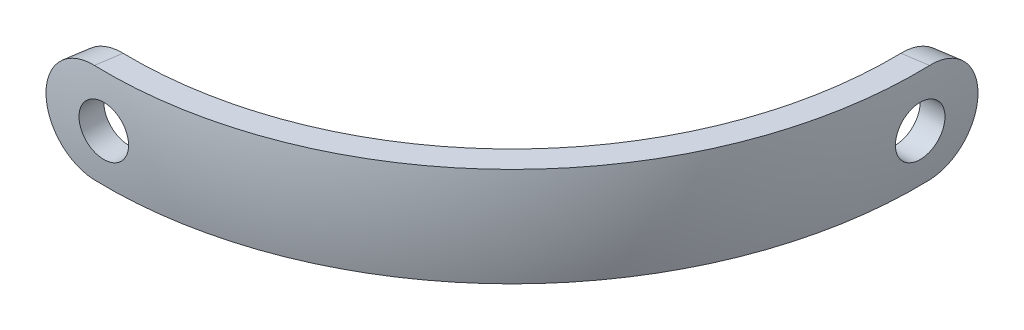
ISO-10303-21;
HEADER;
FILE_DESCRIPTION(('STEP AP214'),'2;1');
FILE_NAME('part.step','',(''),(''),'','','');
FILE_SCHEMA(('AUTOMOTIVE_DESIGN { 1 0 10303 214 1 1 1 1 }'));
ENDSEC;
DATA;
#1=APPLICATION_CONTEXT('core data for automotive mechanical design processes');
#2=APPLICATION_PROTOCOL_DEFINITION('international standard','automotive_design',2000,#1);
#3=PRODUCT_CONTEXT('',#1,'mechanical');
#4=PRODUCT('Part','Part','',(#3));
#5=PRODUCT_RELATED_PRODUCT_CATEGORY('part','',(#4));
#6=PRODUCT_DEFINITION_FORMATION('','',#4);
#7=PRODUCT_DEFINITION_CONTEXT('part definition',#1,'design');
#8=PRODUCT_DEFINITION('design','',#6,#7);
#9=PRODUCT_DEFINITION_SHAPE('','',#8);
#10=(LENGTH_UNIT() NAMED_UNIT(*) SI_UNIT(.MILLI.,.METRE.));
#11=(NAMED_UNIT(*) PLANE_ANGLE_UNIT() SI_UNIT($,.RADIAN.));
#12=(NAMED_UNIT(*) SI_UNIT($,.STERADIAN.) SOLID_ANGLE_UNIT());
#13=UNCERTAINTY_MEASURE_WITH_UNIT(LENGTH_MEASURE(1.E-05),#10,'distance_accuracy_value','');
#14=(GEOMETRIC_REPRESENTATION_CONTEXT(3) GLOBAL_UNCERTAINTY_ASSIGNED_CONTEXT((#13)) GLOBAL_UNIT_ASSIGNED_CONTEXT((#10,
#11,#12)) REPRESENTATION_CONTEXT('',''));
#15=CARTESIAN_POINT('',(0.,0.,0.));
#16=DIRECTION('',(0.,0.,1.));
#17=DIRECTION('',(1.,0.,0.));
#18=AXIS2_PLACEMENT_3D('',#15,#16,#17);
#19=CARTESIAN_POINT('',(0.,0.,0.));
#20=DIRECTION('',(0.,1.,0.));
#21=DIRECTION('',(-0.15093609829513,0.,0.988543521667834));
#22=AXIS2_PLACEMENT_3D('',#19,#20,#21);
#23=SPHERICAL_SURFACE('',#22,66.);
#24=CARTESIAN_POINT('',(0.,-8.,0.));
#25=DIRECTION('',(0.,1.,0.));
#26=DIRECTION('',(0.,0.,1.));
#27=AXIS2_PLACEMENT_3D('',#24,#25,#26);
#28=CIRCLE('',#27,65.5133574166368);
#29=CARTESIAN_POINT('',(-1.90598073848106,-8.,65.4856261894512));
#30=VERTEX_POINT('',#29);
#31=CARTESIAN_POINT('',(65.4856261894512,-8.,-1.90598073848083));
#32=VERTEX_POINT('',#31);
#33=EDGE_CURVE('E108',#30,#32,#28,.T.);
#34=ORIENTED_EDGE('',*,*,#33,.T.);
#35=CARTESIAN_POINT('',(65.4856261894513,-8.00000000000002,-1.90598073848083));
#36=CARTESIAN_POINT('',(65.4789954262735,-8.0000233103956,-2.13380636503772));
#37=CARTESIAN_POINT('',(65.4723466680324,-7.99040586848372,-2.36162869269555));
#38=CARTESIAN_POINT('',(65.4590615649028,-7.95205630562123,-2.81565226137605));
#39=CARTESIAN_POINT('',(65.4524252196232,-7.92332479719068,-3.04185355411083));
#40=CARTESIAN_POINT('',(65.4392164665826,-7.8469344483001,-3.49091461906332));
#41=CARTESIAN_POINT('',(65.4326440263639,-7.79928579247757,-3.7137761224706));
#42=CARTESIAN_POINT('',(65.4196082515972,-7.68539154829749,-4.15469523181643));
#43=CARTESIAN_POINT('',(65.4131449153759,-7.61914624544452,-4.37275291145015));
#44=CARTESIAN_POINT('',(65.4003723194107,-7.46846441023646,-4.80263336844799));
#45=CARTESIAN_POINT('',(65.3940631484835,-7.38401765464266,-5.01445256552379));
#46=CARTESIAN_POINT('',(65.3816509779747,-7.19753197333296,-5.43021139144909));
#47=CARTESIAN_POINT('',(65.3755479819381,-7.09549274531808,-5.63415088482455));
#48=CARTESIAN_POINT('',(65.3635973701703,-6.87455245634858,-6.03262714797209));
#49=CARTESIAN_POINT('',(65.3577496940183,-6.75565541335527,-6.22716614352601));
#50=CARTESIAN_POINT('',(65.3463546734433,-6.50180679345798,-6.60547962172241));
#51=CARTESIAN_POINT('',(65.3408073264033,-6.36685535647739,-6.78925419816224));
#52=CARTESIAN_POINT('',(65.330076416556,-6.08233584219565,-7.14407924927709));
#53=CARTESIAN_POINT('',(65.3248916570049,-5.93282016731225,-7.31517170627174));
#54=CARTESIAN_POINT('',(65.3149071359619,-5.61982791940914,-7.64408273801211));
#55=CARTESIAN_POINT('',(65.3101073719165,-5.45635143899958,-7.80190140079685));
#56=CARTESIAN_POINT('',(65.3009316167273,-5.11655454974038,-8.10313406933744));
#57=CARTESIAN_POINT('',(65.2965557115089,-4.94023154926556,-8.24654515458513));
#58=CARTESIAN_POINT('',(65.2882656149023,-4.57602698024453,-8.51785947995783));
#59=CARTESIAN_POINT('',(65.2843514135424,-4.38814566146545,-8.64576305501192));
#60=CARTESIAN_POINT('',(65.2770429270389,-4.00348106201142,-8.88429430877204));
#61=CARTESIAN_POINT('',(65.2736452821293,-3.80676713315995,-8.9950337267011));
#62=CARTESIAN_POINT('',(65.2673671119725,-3.4046652121777,-9.19945243433636));
#63=CARTESIAN_POINT('',(65.2644865740594,-3.19927743265474,-9.29313214190055));
#64=CARTESIAN_POINT('',(65.2592686408014,-2.78139642315218,-9.46269001732263));
#65=CARTESIAN_POINT('',(65.2569309497075,-2.56890713468049,-9.53857787859032));
#66=CARTESIAN_POINT('',(65.2528175009855,-2.13833429253245,-9.67202954219864));
#67=CARTESIAN_POINT('',(65.2510415972016,-1.92025220987702,-9.7295981105481));
#68=CARTESIAN_POINT('',(65.2476678217308,-1.42093834111765,-9.83891970300549));
#69=CARTESIAN_POINT('',(65.2462448406436,-1.13842816357406,-9.88499151160208));
#70=CARTESIAN_POINT('',(65.2448216968505,-0.712518044561883,-9.9310605436528));
#71=CARTESIAN_POINT('',(65.2444658706974,-0.570265376442735,-9.94257709645125));
#72=CARTESIAN_POINT('',(65.2439912519057,-0.285352698509678,-9.95793735613073));
#73=CARTESIAN_POINT('',(65.2438724480644,-0.142692708266861,-9.9617814256485));
#74=CARTESIAN_POINT('',(65.2438724300771,0.,-9.96178248747833));
#75=B_SPLINE_CURVE_WITH_KNOTS('',3,(#35,#36,#37,#38,#39,#40,#41,#42,#43,#44,#45,#46,#47,#48,#49,
#50,#51,#52,#53,#54,#55,#56,#57,#58,#59,#60,#61,#62,#63,#64,#65,#66,#67,#68,#69,#70,#71,#72,#73,
#74),.UNSPECIFIED.,.F.,.F.,(4,2,2,2,2,2,2,2,2,2,2,2,2,2,2,2,2,2,2,4),(0.,0.68355968715997,
1.36709747035441,2.05026774758158,2.7334275370268,3.41697204250441,4.10052829479083,
4.78392189847771,5.46730954642771,6.14832330234018,6.82933254104259,7.51047954731539,
8.19161183964679,8.86810465473374,9.54458089767794,10.2206877197506,10.8966184995181,
11.7534745712575,12.1814558336121,12.6094168671308),.UNSPECIFIED.);
#76=CARTESIAN_POINT('',(65.2438724300771,0.,-9.96178248747833));
#77=VERTEX_POINT('',#76);
#78=EDGE_CURVE('E164',#32,#77,#75,.T.);
#79=ORIENTED_EDGE('',*,*,#78,.T.);
#80=CARTESIAN_POINT('',(65.2438724300771,0.,-9.96178248747833));
#81=CARTESIAN_POINT('',(65.2438715281821,0.223815813935489,-9.96180767475398));
#82=CARTESIAN_POINT('',(65.2441646200338,0.44762756064614,-9.95232678670516));
#83=CARTESIAN_POINT('',(65.2453322640976,0.893640690685671,-9.91453513295925));
#84=CARTESIAN_POINT('',(65.2462067800849,1.11584217346776,-9.88622554035564));
#85=CARTESIAN_POINT('',(65.2485296336511,1.55684949221986,-9.81099476004609));
#86=CARTESIAN_POINT('',(65.2499774207248,1.77565837719574,-9.76409142763105));
#87=CARTESIAN_POINT('',(65.253434103878,2.20854276854098,-9.65202872262628));
#88=CARTESIAN_POINT('',(65.2554429946425,2.42261831972601,-9.58686952296478));
#89=CARTESIAN_POINT('',(65.2600057421423,2.84460767363624,-9.43874403823712));
#90=CARTESIAN_POINT('',(65.2625598174613,3.05251896670285,-9.35577061074614));
#91=CARTESIAN_POINT('',(65.2681908379462,3.4606281390898,-9.17264130519558));
#92=CARTESIAN_POINT('',(65.2712677934979,3.6608258651041,-9.07248508584597));
#93=CARTESIAN_POINT('',(65.2779182536187,4.0520736893096,-8.85573855454025));
#94=CARTESIAN_POINT('',(65.2814916921116,4.24312500024299,-8.73915042945478));
#95=CARTESIAN_POINT('',(65.2891057170139,4.61477685309646,-8.49037849568757));
#96=CARTESIAN_POINT('',(65.2931463022765,4.79537742067364,-8.35819472529634));
#97=CARTESIAN_POINT('',(65.3016742417094,5.14540354353712,-8.07876732231392));
#98=CARTESIAN_POINT('',(65.3061628996878,5.31479395225281,-7.93147970429566));
#99=CARTESIAN_POINT('',(65.3155417434446,5.64068705350649,-7.6231887931853));
#100=CARTESIAN_POINT('',(65.320432059081,5.79718554500619,-7.46218106367407));
#101=CARTESIAN_POINT('',(65.3305738296018,6.09616512663733,-7.12763970755624));
#102=CARTESIAN_POINT('',(65.3358252971299,6.23864572558021,-6.95410564239451));
#103=CARTESIAN_POINT('',(65.3466476715699,6.50861389975807,-6.59575158349769));
#104=CARTESIAN_POINT('',(65.3522185812293,6.63610134600025,-6.41093149268463));
#105=CARTESIAN_POINT('',(65.3636777943065,6.8760862765547,-6.02993756857892));
#106=CARTESIAN_POINT('',(65.3695681026782,6.98846861944511,-5.83369125732056));
#107=CARTESIAN_POINT('',(65.3815808986342,7.19634670784248,-5.43254364953888));
#108=CARTESIAN_POINT('',(65.387703308335,7.29184805805133,-5.2276452537135));
#109=CARTESIAN_POINT('',(65.4001344745942,7.46534787542045,-4.81061436910646));
#110=CARTESIAN_POINT('',(65.4064431919309,7.54334999723002,-4.5984834015015));
#111=CARTESIAN_POINT('',(65.4191982107735,7.68133407609446,-4.16853128012712));
#112=CARTESIAN_POINT('',(65.4256444815396,7.74132001506257,-3.95071139530001));
#113=CARTESIAN_POINT('',(65.4409672059143,7.86116336458124,-3.43163143664057));
#114=CARTESIAN_POINT('',(65.4498844438318,7.91322690154687,-3.12851737334894));
#115=CARTESIAN_POINT('',(65.463287886478,7.96528555998269,-2.67128048811481));
#116=CARTESIAN_POINT('',(65.4677581104079,7.9782989949768,-2.5185157259701));
#117=CARTESIAN_POINT('',(65.4766965844778,7.99565488126796,-2.21250765463606));
#118=CARTESIAN_POINT('',(65.4811648347559,7.99999808827434,-2.05926438832007));
#119=CARTESIAN_POINT('',(65.4856261894512,8.,-1.90598073848083));
#120=B_SPLINE_CURVE_WITH_KNOTS('',3,(#80,#81,#82,#83,#84,#85,#86,#87,#88,#89,#90,#91,#92,#93,
#94,#95,#96,#97,#98,#99,#100,#101,#102,#103,#104,#105,#106,#107,#108,#109,#110,#111,#112,#113,
#114,#115,#116,#117,#118,#119),.UNSPECIFIED.,.F.,.F.,(4,2,2,2,2,2,2,2,2,2,2,2,2,2,2,2,2,2,2,4),
(0.,0.671240685404947,1.34243955410822,2.01299543582438,2.68354496593199,3.35436384947467,
4.02519605857631,4.69593907288629,5.36668044041832,6.03943382022609,6.71240556738392,
7.38540088715677,8.0584019965863,8.7362728962071,9.41391830969144,10.0914220674098,
10.7687759737513,11.6895613996959,12.1495054817856,12.6094094727469),.UNSPECIFIED.);
#121=CARTESIAN_POINT('',(65.4856261894512,8.,-1.90598073848083));
#122=VERTEX_POINT('',#121);
#123=EDGE_CURVE('E158',#77,#122,#120,.T.);
#124=ORIENTED_EDGE('',*,*,#123,.T.);
#125=CARTESIAN_POINT('',(0.,8.,0.));
#126=DIRECTION('',(0.,1.,0.));
#127=DIRECTION('',(0.,0.,1.));
#128=AXIS2_PLACEMENT_3D('',#125,#126,#127);
#129=CIRCLE('',#128,65.5133574166368);
#130=CARTESIAN_POINT('',(-1.90598073848106,8.,65.4856261894512));
#131=VERTEX_POINT('',#130);
#132=EDGE_CURVE('E110',#131,#122,#129,.T.);
#133=ORIENTED_EDGE('',*,*,#132,.F.);
#134=CARTESIAN_POINT('',(-1.90598073848106,8.,65.4856261894513));
#135=CARTESIAN_POINT('',(-2.13380636503794,8.00002331039559,65.4789954262735));
#136=CARTESIAN_POINT('',(-2.36162869269578,7.99040586848371,65.4723466680324));
#137=CARTESIAN_POINT('',(-2.81565226137628,7.95205630562121,65.4590615649028));
#138=CARTESIAN_POINT('',(-3.04185355411106,7.92332479719066,65.4524252196232));
#139=CARTESIAN_POINT('',(-3.49091461906355,7.84693444830008,65.4392164665826));
#140=CARTESIAN_POINT('',(-3.71377612247082,7.79928579247756,65.4326440263639));
#141=CARTESIAN_POINT('',(-4.15469523181665,7.68539154829748,65.4196082515972));
#142=CARTESIAN_POINT('',(-4.37275291145037,7.6191462454445,65.4131449153759));
#143=CARTESIAN_POINT('',(-4.80263336844821,7.46846441023645,65.4003723194107));
#144=CARTESIAN_POINT('',(-5.01445256552401,7.38401765464265,65.3940631484835));
#145=CARTESIAN_POINT('',(-5.43021139144931,7.19753197333295,65.3816509779747));
#146=CARTESIAN_POINT('',(-5.63415088482477,7.09549274531806,65.3755479819381));
#147=CARTESIAN_POINT('',(-6.03262714797231,6.87455245634856,65.3635973701703));
#148=CARTESIAN_POINT('',(-6.22716614352623,6.75565541335526,65.3577496940183));
#149=CARTESIAN_POINT('',(-6.60547962172263,6.50180679345797,65.3463546734433));
#150=CARTESIAN_POINT('',(-6.78925419816246,6.36685535647738,65.3408073264033));
#151=CARTESIAN_POINT('',(-7.14407924927731,6.08233584219563,65.330076416556));
#152=CARTESIAN_POINT('',(-7.31517170627196,5.93282016731223,65.3248916570049));
#153=CARTESIAN_POINT('',(-7.64408273801233,5.61982791940912,65.3149071359619));
#154=CARTESIAN_POINT('',(-7.80190140079706,5.45635143899957,65.3101073719165));
#155=CARTESIAN_POINT('',(-8.10313406933766,5.11655454974037,65.3009316167273));
#156=CARTESIAN_POINT('',(-8.24654515458535,4.94023154926555,65.2965557115089));
#157=CARTESIAN_POINT('',(-8.51785947995805,4.57602698024452,65.2882656149023));
#158=CARTESIAN_POINT('',(-8.64576305501214,4.38814566146545,65.2843514135424));
#159=CARTESIAN_POINT('',(-8.88429430877226,4.00348106201141,65.2770429270388));
#160=CARTESIAN_POINT('',(-8.99503372670132,3.80676713315995,65.2736452821293));
#161=CARTESIAN_POINT('',(-9.19945243433658,3.40466521217769,65.2673671119725));
#162=CARTESIAN_POINT('',(-9.29313214190077,3.19927743265473,65.2644865740594));
#163=CARTESIAN_POINT('',(-9.46269001732285,2.78139642315217,65.2592686408013));
#164=CARTESIAN_POINT('',(-9.53857787859054,2.56890713468048,65.2569309497075));
#165=CARTESIAN_POINT('',(-9.67202954219886,2.13833429253245,65.2528175009855));
#166=CARTESIAN_POINT('',(-9.72959811054832,1.92025220987701,65.2510415972015));
#167=CARTESIAN_POINT('',(-9.8389197030057,1.42093834111764,65.2476678217307));
#168=CARTESIAN_POINT('',(-9.8849915116023,1.13842816357404,65.2462448406435));
#169=CARTESIAN_POINT('',(-9.93106054365302,0.712518044561869,65.2448216968504));
#170=CARTESIAN_POINT('',(-9.94257709645147,0.570265376442721,65.2444658706974));
#171=CARTESIAN_POINT('',(-9.95793735613095,0.285352698509663,65.2439912519057));
#172=CARTESIAN_POINT('',(-9.96178142564872,0.142692708266845,65.2438724480644));
#173=CARTESIAN_POINT('',(-9.96178248747855,0.,65.243872430077));
#174=B_SPLINE_CURVE_WITH_KNOTS('',3,(#134,#135,#136,#137,#138,#139,#140,#141,#142,#143,#144,
#145,#146,#147,#148,#149,#150,#151,#152,#153,#154,#155,#156,#157,#158,#159,#160,#161,#162,#163,
#164,#165,#166,#167,#168,#169,#170,#171,#172,#173),.UNSPECIFIED.,.F.,.F.,(4,2,2,2,2,2,2,2,2,2,2,
2,2,2,2,2,2,2,2,4),(0.,0.68355968715997,1.36709747035441,2.05026774758158,2.7334275370268,
3.4169720425044,4.10052829479082,4.7839218984777,5.4673095464277,6.14832330234017,
6.82933254104258,7.51047954731538,8.19161183964677,8.86810465473373,9.54458089767793,
10.2206877197505,10.8966184995181,11.7534745712575,12.1814558336121,12.6094168671308),.UNSPECIFIED.);
#175=CARTESIAN_POINT('',(-9.96178248747855,0.,65.243872430077));
#176=VERTEX_POINT('',#175);
#177=EDGE_CURVE('E133',#131,#176,#174,.T.);
#178=ORIENTED_EDGE('',*,*,#177,.T.);
#179=CARTESIAN_POINT('',(-9.96178248747855,0.,65.243872430077));
#180=CARTESIAN_POINT('',(-9.9618076747542,-0.223815813935505,65.2438715281821));
#181=CARTESIAN_POINT('',(-9.95232678670538,-0.447627560646156,65.2441646200338));
#182=CARTESIAN_POINT('',(-9.91453513295947,-0.893640690685688,65.2453322640976));
#183=CARTESIAN_POINT('',(-9.88622554035586,-1.11584217346777,65.2462067800849));
#184=CARTESIAN_POINT('',(-9.81099476004631,-1.55684949221988,65.2485296336511));
#185=CARTESIAN_POINT('',(-9.76409142763128,-1.77565837719576,65.2499774207248));
#186=CARTESIAN_POINT('',(-9.65202872262651,-2.208542768541,65.253434103878));
#187=CARTESIAN_POINT('',(-9.586869522965,-2.42261831972603,65.2554429946425));
#188=CARTESIAN_POINT('',(-9.43874403823734,-2.84460767363626,65.2600057421423));
#189=CARTESIAN_POINT('',(-9.35577061074636,-3.05251896670287,65.2625598174612));
#190=CARTESIAN_POINT('',(-9.1726413051958,-3.46062813908982,65.2681908379462));
#191=CARTESIAN_POINT('',(-9.07248508584618,-3.66082586510412,65.2712677934979));
#192=CARTESIAN_POINT('',(-8.85573855454046,-4.05207368930962,65.2779182536187));
#193=CARTESIAN_POINT('',(-8.73915042945499,-4.24312500024301,65.2814916921115));
#194=CARTESIAN_POINT('',(-8.49037849568779,-4.61477685309647,65.2891057170139));
#195=CARTESIAN_POINT('',(-8.35819472529656,-4.79537742067366,65.2931463022764));
#196=CARTESIAN_POINT('',(-8.07876732231414,-5.14540354353714,65.3016742417094));
#197=CARTESIAN_POINT('',(-7.93147970429587,-5.31479395225283,65.3061628996877));
#198=CARTESIAN_POINT('',(-7.62318879318552,-5.6406870535065,65.3155417434446));
#199=CARTESIAN_POINT('',(-7.46218106367429,-5.7971855450062,65.320432059081));
#200=CARTESIAN_POINT('',(-7.12763970755646,-6.09616512663734,65.3305738296017));
#201=CARTESIAN_POINT('',(-6.95410564239474,-6.23864572558023,65.3358252971299));
#202=CARTESIAN_POINT('',(-6.59575158349791,-6.50861389975809,65.3466476715699));
#203=CARTESIAN_POINT('',(-6.41093149268486,-6.63610134600027,65.3522185812293));
#204=CARTESIAN_POINT('',(-6.02993756857914,-6.87608627655472,65.3636777943065));
#205=CARTESIAN_POINT('',(-5.83369125732079,-6.98846861944513,65.3695681026782));
#206=CARTESIAN_POINT('',(-5.4325436495391,-7.19634670784249,65.3815808986342));
#207=CARTESIAN_POINT('',(-5.22764525371372,-7.29184805805135,65.387703308335));
#208=CARTESIAN_POINT('',(-4.81061436910669,-7.46534787542047,65.4001344745942));
#209=CARTESIAN_POINT('',(-4.59848340150172,-7.54334999723003,65.4064431919309));
#210=CARTESIAN_POINT('',(-4.16853128012735,-7.68133407609448,65.4191982107734));
#211=CARTESIAN_POINT('',(-3.95071139530024,-7.74132001506258,65.4256444815395));
#212=CARTESIAN_POINT('',(-3.4316314366408,-7.86116336458125,65.4409672059143));
#213=CARTESIAN_POINT('',(-3.12851737334917,-7.91322690154688,65.4498844438318));
#214=CARTESIAN_POINT('',(-2.67128048811503,-7.96528555998271,65.463287886478));
#215=CARTESIAN_POINT('',(-2.51851572597032,-7.97829899497682,65.4677581104079));
#216=CARTESIAN_POINT('',(-2.21250765463628,-7.99565488126797,65.4766965844778));
#217=CARTESIAN_POINT('',(-2.05926438832029,-7.99999808827436,65.4811648347559));
#218=CARTESIAN_POINT('',(-1.90598073848106,-8.00000000000002,65.4856261894512));
#219=B_SPLINE_CURVE_WITH_KNOTS('',3,(#179,#180,#181,#182,#183,#184,#185,#186,#187,#188,#189,
#190,#191,#192,#193,#194,#195,#196,#197,#198,#199,#200,#201,#202,#203,#204,#205,#206,#207,#208,
#209,#210,#211,#212,#213,#214,#215,#216,#217,#218),.UNSPECIFIED.,.F.,.F.,(4,2,2,2,2,2,2,2,2,2,2,
2,2,2,2,2,2,2,2,4),(0.,0.671240685404947,1.34243955410822,2.01299543582438,2.68354496593199,
3.35436384947468,4.02519605857632,4.69593907288629,5.36668044041832,6.03943382022609,
6.71240556738392,7.38540088715677,8.0584019965863,8.73627289620709,9.41391830969144,
10.0914220674098,10.7687759737513,11.6895613996959,12.1495054817856,12.6094094727469),.UNSPECIFIED.);
#220=EDGE_CURVE('E140',#176,#30,#219,.T.);
#221=ORIENTED_EDGE('',*,*,#220,.T.);
#222=EDGE_LOOP('',(#34,#79,#124,#133,#178,#221));
#223=FACE_BOUND('',#222,.T.);
#224=CARTESIAN_POINT('',(0.,0.,65.8786763680024));
#225=DIRECTION('',(0.,0.,-1.));
#226=DIRECTION('',(-1.,0.,0.));
#227=AXIS2_PLACEMENT_3D('',#224,#225,#226);
#228=CIRCLE('',#227,4.);
#229=CARTESIAN_POINT('',(-4.,0.,65.8786763680024));
#230=VERTEX_POINT('',#229);
#231=EDGE_CURVE('E119',#230,#230,#228,.F.);
#232=ORIENTED_EDGE('',*,*,#231,.F.);
#233=EDGE_LOOP('',(#232));
#234=FACE_BOUND('',#233,.T.);
#235=CARTESIAN_POINT('',(65.8786763680024,0.,0.));
#236=DIRECTION('',(-1.,0.,0.));
#237=DIRECTION('',(0.,0.,1.));
#238=AXIS2_PLACEMENT_3D('',#235,#236,#237);
#239=CIRCLE('',#238,4.);
#240=CARTESIAN_POINT('',(65.8786763680024,0.,4.));
#241=VERTEX_POINT('',#240);
#242=EDGE_CURVE('E127',#241,#241,#239,.F.);
#243=ORIENTED_EDGE('',*,*,#242,.F.);
#244=EDGE_LOOP('',(#243));
#245=FACE_BOUND('',#244,.T.);
#246=ADVANCED_FACE('F34',(#223,#234,#245),#23,.T.);
#247=CARTESIAN_POINT('',(0.,0.,0.));
#248=DIRECTION('',(0.,1.,0.));
#249=DIRECTION('',(-0.15093609829513,0.,0.988543521667834));
#250=AXIS2_PLACEMENT_3D('',#247,#248,#249);
#251=SPHERICAL_SURFACE('',#250,62.);
#252=CARTESIAN_POINT('',(61.4681159102472,8.,-1.29256583755613));
#253=CARTESIAN_POINT('',(61.4633160339981,8.00002318911533,-1.5208346843187));
#254=CARTESIAN_POINT('',(61.4584942637824,7.99039213086689,-1.74910040824308));
#255=CARTESIAN_POINT('',(61.4488426616479,7.95198707509647,-2.20400916020088));
#256=CARTESIAN_POINT('',(61.444012829973,7.92321364662202,-2.43065223626851));
#257=CARTESIAN_POINT('',(61.4343829839777,7.84670879153026,-2.88059888463439));
#258=CARTESIAN_POINT('',(61.4295829557781,7.79898698651129,-3.10390409221164));
#259=CARTESIAN_POINT('',(61.4200468627115,7.68491392802944,-3.54570235816429));
#260=CARTESIAN_POINT('',(61.4153107968336,7.61856296937974,-3.76419549263351));
#261=CARTESIAN_POINT('',(61.4059367834899,7.46763414335209,-4.19493759508925));
#262=CARTESIAN_POINT('',(61.4012988940821,7.38304580448198,-4.40718289580381));
#263=CARTESIAN_POINT('',(61.3921611339678,7.196239691058,-4.82377636049975));
#264=CARTESIAN_POINT('',(61.3876612655577,7.09402162336608,-5.02812439310026));
#265=CARTESIAN_POINT('',(61.3788376638389,6.87268539358003,-5.42739260628106));
#266=CARTESIAN_POINT('',(61.3745138875371,6.75357138888148,-5.6223150903275));
#267=CARTESIAN_POINT('',(61.3660776714203,6.49924870498072,-6.00136519255455));
#268=CARTESIAN_POINT('',(61.3619652296615,6.36404017384996,-6.18549291002496));
#269=CARTESIAN_POINT('',(61.3540028425465,6.07903765305285,-6.54089680240757));
#270=CARTESIAN_POINT('',(61.3501519201843,5.92930367898435,-6.71222108161002));
#271=CARTESIAN_POINT('',(61.3427283382239,5.61584886406243,-7.04156336722653));
#272=CARTESIAN_POINT('',(61.3391556765246,5.4521281288453,-7.19958147411876));
#273=CARTESIAN_POINT('',(61.3323196429929,5.11181708265923,-7.50117376314906));
#274=CARTESIAN_POINT('',(61.3290563338058,4.93522417777337,-7.64474502009794));
#275=CARTESIAN_POINT('',(61.3228694231964,4.57045605189914,-7.91633307468736));
#276=CARTESIAN_POINT('',(61.3199458141454,4.38228109115178,-8.04435022162623));
#277=CARTESIAN_POINT('',(61.3144864104723,3.99719448921096,-8.28294058441823));
#278=CARTESIAN_POINT('',(61.3119477821904,3.80036198537701,-8.39364146858905));
#279=CARTESIAN_POINT('',(61.3072547706736,3.39802282604416,-8.597957085376));
#280=CARTESIAN_POINT('',(61.3051003776223,3.19251639230838,-8.69157225449075));
#281=CARTESIAN_POINT('',(61.301196890984,2.7744023301789,-8.86097032682565));
#282=CARTESIAN_POINT('',(61.2994475720185,2.56179872627597,-8.93676314655411));
#283=CARTESIAN_POINT('',(61.2963695784622,2.13100211555515,-9.06999218187734));
#284=CARTESIAN_POINT('',(61.2950407933413,1.91281059374917,-9.12743322095901));
#285=CARTESIAN_POINT('',(61.2925245830769,1.41459888924597,-9.23613410750344));
#286=CARTESIAN_POINT('',(61.2914650636425,1.13333561383059,-9.28184638788068));
#287=CARTESIAN_POINT('',(61.2904053142293,0.709321854471289,-9.32755590350162));
#288=CARTESIAN_POINT('',(61.2901403197926,0.567705666425831,-9.33898258011681));
#289=CARTESIAN_POINT('',(61.2897868413652,0.284070394117902,-9.35422299604842));
#290=CARTESIAN_POINT('',(61.2896983494036,0.142051328339593,-9.35803707915186));
#291=CARTESIAN_POINT('',(61.2896983434057,0.,-9.35803809429782));
#292=B_SPLINE_CURVE_WITH_KNOTS('',3,(#252,#253,#254,#255,#256,#257,#258,#259,#260,#261,#262,
#263,#264,#265,#266,#267,#268,#269,#270,#271,#272,#273,#274,#275,#276,#277,#278,#279,#280,#281,
#282,#283,#284,#285,#286,#287,#288,#289,#290,#291),.UNSPECIFIED.,.F.,.F.,(4,2,2,2,2,2,2,2,2,2,2,
2,2,2,2,2,2,2,2,4),(0.,0.68475126148407,1.36948216819447,2.05386582628232,2.73823865435821,
3.42300548535609,4.10778370340194,4.79239371702418,5.47699743264444,6.15888413195131,
6.84076568170253,7.5227850217531,8.20478904287799,8.8815001701866,9.55819400674431,
10.2345104293658,10.9106489459666,11.7636581165152,12.1897157589827,12.6157541601224),.UNSPECIFIED.);
#293=CARTESIAN_POINT('',(61.4681159102472,8.,-1.29256583755614));
#294=VERTEX_POINT('',#293);
#295=CARTESIAN_POINT('',(61.2896983434057,0.,-9.35803809429782));
#296=VERTEX_POINT('',#295);
#297=EDGE_CURVE('E52',#294,#296,#292,.T.);
#298=ORIENTED_EDGE('',*,*,#297,.T.);
#299=CARTESIAN_POINT('',(61.2896983434057,0.,-9.35803809429783));
#300=CARTESIAN_POINT('',(61.289697607511,-0.223658291244617,-9.35806341694852));
#301=CARTESIAN_POINT('',(61.289917622217,-0.447312438744684,-9.34858463654143));
#302=CARTESIAN_POINT('',(61.2907938260942,-0.893010321245859,-9.31080216627045));
#303=CARTESIAN_POINT('',(61.2914499872801,-1.11505415864834,-9.28249968422772));
#304=CARTESIAN_POINT('',(61.2931923008486,-1.55574143759732,-9.20729009198449));
#305=CARTESIAN_POINT('',(61.2942780294058,-1.77438801067824,-9.16040131954364));
#306=CARTESIAN_POINT('',(61.2968691165606,-2.20695010532703,-9.04837646099281));
#307=CARTESIAN_POINT('',(61.2983744713321,-2.42086567001199,-8.98324054125628));
#308=CARTESIAN_POINT('',(61.3017916017023,-2.84253695962453,-8.83517329477073));
#309=CARTESIAN_POINT('',(61.3037035362361,-3.05029023937593,-8.75223500882736));
#310=CARTESIAN_POINT('',(61.3079159345256,-3.45809042382398,-8.56918964137586));
#311=CARTESIAN_POINT('',(61.3102164061892,-3.6581371715697,-8.46908221042773));
#312=CARTESIAN_POINT('',(61.3151846409097,-4.04909483347882,-8.2524486064348));
#313=CARTESIAN_POINT('',(61.3178523574107,-4.24000690152543,-8.13592451449944));
#314=CARTESIAN_POINT('',(61.323531378077,-4.61139520062166,-7.88729851560817));
#315=CARTESIAN_POINT('',(61.3265426815261,-4.79187145342303,-7.75519664112334));
#316=CARTESIAN_POINT('',(61.3328931123496,-5.1417403181857,-7.47589552188051));
#317=CARTESIAN_POINT('',(61.3362333223095,-5.31109304749283,-7.32864634404604));
#318=CARTESIAN_POINT('',(61.3432048458401,-5.63692601397781,-7.02044175898812));
#319=CARTESIAN_POINT('',(61.3468362535323,-5.79340205574448,-6.85948191912203));
#320=CARTESIAN_POINT('',(61.3543581873385,-6.09235727153817,-6.52504676358525));
#321=CARTESIAN_POINT('',(61.3582487225268,-6.23483595496955,-6.35157100961163));
#322=CARTESIAN_POINT('',(61.3662560742337,-6.50482656978161,-5.99334377980698));
#323=CARTESIAN_POINT('',(61.3703728929329,-6.63233835690582,-5.80859219532143));
#324=CARTESIAN_POINT('',(61.3788332243527,-6.87251251535646,-5.42757279965067));
#325=CARTESIAN_POINT('',(61.3831783098168,-6.98504553887168,-5.2312234755366));
#326=CARTESIAN_POINT('',(61.3920268776351,-7.19323212058498,-4.82986164483969));
#327=CARTESIAN_POINT('',(61.396530307072,-7.28889125479113,-4.6248520279283));
#328=CARTESIAN_POINT('',(61.4056603093865,-7.46271817962313,-4.20758811626919));
#329=CARTESIAN_POINT('',(61.4102868577988,-7.54088941671695,-3.99533525851996));
#330=CARTESIAN_POINT('',(61.4196259586109,-7.67922499079556,-3.5651299999595));
#331=CARTESIAN_POINT('',(61.4243384919898,-7.73939326023513,-3.34717885517303));
#332=CARTESIAN_POINT('',(61.4355512820077,-7.86000385786917,-2.82639865343716));
#333=CARTESIAN_POINT('',(61.4420751798418,-7.91250257585216,-2.52167289204097));
#334=CARTESIAN_POINT('',(61.4518581201396,-7.96499599870421,-2.06198757803866));
#335=CARTESIAN_POINT('',(61.4551170319008,-7.97811802082902,-1.90840167208255));
#336=CARTESIAN_POINT('',(61.4616256002168,-7.99561863933369,-1.60074606363388));
#337=CARTESIAN_POINT('',(61.4648752575757,-7.99999801997293,-1.4466764057783));
#338=CARTESIAN_POINT('',(61.4681159102472,-8.00000000000002,-1.29256583755613));
#339=B_SPLINE_CURVE_WITH_KNOTS('',3,(#299,#300,#301,#302,#303,#304,#305,#306,#307,#308,#309,
#310,#311,#312,#313,#314,#315,#316,#317,#318,#319,#320,#321,#322,#323,#324,#325,#326,#327,#328,
#329,#330,#331,#332,#333,#334,#335,#336,#337,#338),.UNSPECIFIED.,.F.,.F.,(4,2,2,2,2,2,2,2,2,2,2,
2,2,2,2,2,2,2,2,4),(0.,0.670768026596121,1.34149301757246,2.01155789289426,2.68161665891183,
3.35193783888383,4.02227266338134,4.6925225871192,5.36277111378006,6.03530458065848,
6.70805630819646,7.38083160671146,8.05361338915058,8.73187259658216,9.40990725040015,
10.0878081610155,10.7655608869461,11.6911234630641,12.1534553546861,12.6157457709229),.UNSPECIFIED.);
#340=CARTESIAN_POINT('',(61.4681159102472,-8.00000000000004,-1.29256583755613));
#341=VERTEX_POINT('',#340);
#342=EDGE_CURVE('E115',#296,#341,#339,.T.);
#343=ORIENTED_EDGE('',*,*,#342,.T.);
#344=CARTESIAN_POINT('',(0.,-8.00000000000004,0.));
#345=DIRECTION('',(0.,1.,0.));
#346=DIRECTION('',(0.,0.,1.));
#347=AXIS2_PLACEMENT_3D('',#344,#345,#346);
#348=CIRCLE('',#347,61.4817045957576);
#349=CARTESIAN_POINT('',(-1.29256583755634,-8.00000000000004,61.4681159102472));
#350=VERTEX_POINT('',#349);
#351=EDGE_CURVE('E105',#350,#341,#348,.T.);
#352=ORIENTED_EDGE('',*,*,#351,.F.);
#353=CARTESIAN_POINT('',(-1.29256583755634,-8.00000000000002,61.4681159102472));
#354=CARTESIAN_POINT('',(-1.52083468431891,-8.00002318911535,61.4633160339981));
#355=CARTESIAN_POINT('',(-1.74910040824329,-7.99039213086691,61.4584942637824));
#356=CARTESIAN_POINT('',(-2.20400916020109,-7.95198707509649,61.4488426616479));
#357=CARTESIAN_POINT('',(-2.43065223626872,-7.92321364662205,61.444012829973));
#358=CARTESIAN_POINT('',(-2.8805988846346,-7.84670879153028,61.4343829839777));
#359=CARTESIAN_POINT('',(-3.10390409221185,-7.79898698651131,61.4295829557781));
#360=CARTESIAN_POINT('',(-3.5457023581645,-7.68491392802945,61.4200468627115));
#361=CARTESIAN_POINT('',(-3.76419549263372,-7.61856296937975,61.4153107968335));
#362=CARTESIAN_POINT('',(-4.19493759508946,-7.46763414335211,61.4059367834899));
#363=CARTESIAN_POINT('',(-4.40718289580402,-7.38304580448199,61.4012988940821));
#364=CARTESIAN_POINT('',(-4.82377636049996,-7.19623969105801,61.3921611339678));
#365=CARTESIAN_POINT('',(-5.02812439310047,-7.0940216233661,61.3876612655576));
#366=CARTESIAN_POINT('',(-5.42739260628127,-6.87268539358005,61.3788376638389));
#367=CARTESIAN_POINT('',(-5.6223150903277,-6.7535713888815,61.3745138875371));
#368=CARTESIAN_POINT('',(-6.00136519255475,-6.49924870498074,61.3660776714203));
#369=CARTESIAN_POINT('',(-6.18549291002517,-6.36404017384998,61.3619652296615));
#370=CARTESIAN_POINT('',(-6.54089680240778,-6.07903765305286,61.3540028425465));
#371=CARTESIAN_POINT('',(-6.71222108161023,-5.92930367898436,61.3501519201843));
#372=CARTESIAN_POINT('',(-7.04156336722674,-5.61584886406245,61.3427283382239));
#373=CARTESIAN_POINT('',(-7.19958147411897,-5.45212812884532,61.3391556765246));
#374=CARTESIAN_POINT('',(-7.50117376314927,-5.11181708265924,61.3323196429929));
#375=CARTESIAN_POINT('',(-7.64474502009814,-4.93522417777339,61.3290563338058));
#376=CARTESIAN_POINT('',(-7.91633307468757,-4.57045605189916,61.3228694231963));
#377=CARTESIAN_POINT('',(-8.04435022162644,-4.3822810911518,61.3199458141454));
#378=CARTESIAN_POINT('',(-8.28294058441843,-3.99719448921098,61.3144864104723));
#379=CARTESIAN_POINT('',(-8.39364146858926,-3.80036198537703,61.3119477821904));
#380=CARTESIAN_POINT('',(-8.5979570853762,-3.39802282604419,61.3072547706735));
#381=CARTESIAN_POINT('',(-8.69157225449096,-3.1925163923084,61.3051003776223));
#382=CARTESIAN_POINT('',(-8.86097032682586,-2.77440233017893,61.301196890984));
#383=CARTESIAN_POINT('',(-8.93676314655432,-2.561798726276,61.2994475720185));
#384=CARTESIAN_POINT('',(-9.06999218187754,-2.13100211555517,61.2963695784621));
#385=CARTESIAN_POINT('',(-9.12743322095921,-1.91281059374919,61.2950407933412));
#386=CARTESIAN_POINT('',(-9.23613410750364,-1.414598889246,61.2925245830768));
#387=CARTESIAN_POINT('',(-9.28184638788089,-1.13333561383061,61.2914650636425));
#388=CARTESIAN_POINT('',(-9.32755590350182,-0.709321854471309,61.2904053142292));
#389=CARTESIAN_POINT('',(-9.33898258011702,-0.56770566642585,61.2901403197926));
#390=CARTESIAN_POINT('',(-9.35422299604862,-0.284070394117922,61.2897868413652));
#391=CARTESIAN_POINT('',(-9.35803707915207,-0.142051328339612,61.2896983494035));
#392=CARTESIAN_POINT('',(-9.35803809429803,0.,61.2896983434057));
#393=B_SPLINE_CURVE_WITH_KNOTS('',3,(#353,#354,#355,#356,#357,#358,#359,#360,#361,#362,#363,
#364,#365,#366,#367,#368,#369,#370,#371,#372,#373,#374,#375,#376,#377,#378,#379,#380,#381,#382,
#383,#384,#385,#386,#387,#388,#389,#390,#391,#392),.UNSPECIFIED.,.F.,.F.,(4,2,2,2,2,2,2,2,2,2,2,
2,2,2,2,2,2,2,2,4),(0.,0.684751261484072,1.36948216819447,2.05386582628232,2.73823865435821,
3.42300548535609,4.10778370340194,4.79239371702417,5.47699743264444,6.15888413195131,
6.84076568170253,7.5227850217531,8.20478904287799,8.8815001701866,9.5581940067443,
10.2345104293658,10.9106489459666,11.7636581165152,12.1897157589827,12.6157541601224),.UNSPECIFIED.);
#394=CARTESIAN_POINT('',(-9.35803809429803,0.,61.2896983434057));
#395=VERTEX_POINT('',#394);
#396=EDGE_CURVE('E90',#350,#395,#393,.T.);
#397=ORIENTED_EDGE('',*,*,#396,.T.);
#398=CARTESIAN_POINT('',(-9.35803809429803,0.,61.2896983434057));
#399=CARTESIAN_POINT('',(-9.35806341694873,0.223658291244599,61.2896976075109));
#400=CARTESIAN_POINT('',(-9.34858463654164,0.447312438744666,61.289917622217));
#401=CARTESIAN_POINT('',(-9.31080216627066,0.893010321245841,61.2907938260942));
#402=CARTESIAN_POINT('',(-9.28249968422793,1.11505415864832,61.2914499872801));
#403=CARTESIAN_POINT('',(-9.20729009198469,1.5557414375973,61.2931923008485));
#404=CARTESIAN_POINT('',(-9.16040131954385,1.77438801067822,61.2942780294058));
#405=CARTESIAN_POINT('',(-9.04837646099303,2.20695010532701,61.2968691165606));
#406=CARTESIAN_POINT('',(-8.98324054125649,2.42086567001197,61.2983744713321));
#407=CARTESIAN_POINT('',(-8.83517329477094,2.84253695962451,61.3017916017023));
#408=CARTESIAN_POINT('',(-8.75223500882757,3.05029023937591,61.3037035362361));
#409=CARTESIAN_POINT('',(-8.56918964137607,3.45809042382396,61.3079159345256));
#410=CARTESIAN_POINT('',(-8.46908221042794,3.65813717156968,61.3102164061891));
#411=CARTESIAN_POINT('',(-8.252448606435,4.0490948334788,61.3151846409096));
#412=CARTESIAN_POINT('',(-8.13592451449966,4.24000690152541,61.3178523574107));
#413=CARTESIAN_POINT('',(-7.88729851560838,4.61139520062163,61.323531378077));
#414=CARTESIAN_POINT('',(-7.75519664112355,4.791871453423,61.3265426815261));
#415=CARTESIAN_POINT('',(-7.47589552188072,5.14174031818567,61.3328931123496));
#416=CARTESIAN_POINT('',(-7.32864634404625,5.31109304749281,61.3362333223095));
#417=CARTESIAN_POINT('',(-7.02044175898833,5.63692601397779,61.34320484584));
#418=CARTESIAN_POINT('',(-6.85948191912224,5.79340205574446,61.3468362535322));
#419=CARTESIAN_POINT('',(-6.52504676358546,6.09235727153815,61.3543581873385));
#420=CARTESIAN_POINT('',(-6.35157100961184,6.23483595496953,61.3582487225268));
#421=CARTESIAN_POINT('',(-5.9933437798072,6.50482656978159,61.3662560742337));
#422=CARTESIAN_POINT('',(-5.80859219532164,6.6323383569058,61.3703728929328));
#423=CARTESIAN_POINT('',(-5.42757279965088,6.87251251535645,61.3788332243526));
#424=CARTESIAN_POINT('',(-5.23122347553682,6.98504553887166,61.3831783098168));
#425=CARTESIAN_POINT('',(-4.82986164483991,7.19323212058496,61.3920268776351));
#426=CARTESIAN_POINT('',(-4.62485202792852,7.28889125479111,61.396530307072));
#427=CARTESIAN_POINT('',(-4.2075881162694,7.46271817962311,61.4056603093865));
#428=CARTESIAN_POINT('',(-3.99533525852017,7.54088941671693,61.4102868577988));
#429=CARTESIAN_POINT('',(-3.56512999995972,7.67922499079554,61.4196259586109));
#430=CARTESIAN_POINT('',(-3.34717885517325,7.73939326023511,61.4243384919898));
#431=CARTESIAN_POINT('',(-2.82639865343737,7.86000385786916,61.4355512820077));
#432=CARTESIAN_POINT('',(-2.52167289204118,7.91250257585215,61.4420751798418));
#433=CARTESIAN_POINT('',(-2.06198757803888,7.9649959987042,61.4518581201396));
#434=CARTESIAN_POINT('',(-1.90840167208277,7.97811802082901,61.4551170319008));
#435=CARTESIAN_POINT('',(-1.6007460636341,7.99561863933367,61.4616256002168));
#436=CARTESIAN_POINT('',(-1.44667640577852,7.99999801997292,61.4648752575757));
#437=CARTESIAN_POINT('',(-1.29256583755635,8.,61.4681159102472));
#438=B_SPLINE_CURVE_WITH_KNOTS('',3,(#398,#399,#400,#401,#402,#403,#404,#405,#406,#407,#408,
#409,#410,#411,#412,#413,#414,#415,#416,#417,#418,#419,#420,#421,#422,#423,#424,#425,#426,#427,
#428,#429,#430,#431,#432,#433,#434,#435,#436,#437),.UNSPECIFIED.,.F.,.F.,(4,2,2,2,2,2,2,2,2,2,2,
2,2,2,2,2,2,2,2,4),(0.,0.670768026596121,1.34149301757246,2.01155789289426,2.68161665891183,
3.35193783888383,4.02227266338134,4.69252258711919,5.36277111378006,6.03530458065847,
6.70805630819646,7.38083160671145,8.05361338915057,8.73187259658215,9.40990725040014,
10.0878081610155,10.7655608869461,11.6911234630641,12.1534553546861,12.6157457709229),.UNSPECIFIED.);
#439=CARTESIAN_POINT('',(-1.29256583755635,8.,61.4681159102472));
#440=VERTEX_POINT('',#439);
#441=EDGE_CURVE('E98',#395,#440,#438,.T.);
#442=ORIENTED_EDGE('',*,*,#441,.T.);
#443=CARTESIAN_POINT('',(0.,8.,0.));
#444=DIRECTION('',(0.,1.,0.));
#445=DIRECTION('',(0.,0.,1.));
#446=AXIS2_PLACEMENT_3D('',#443,#444,#445);
#447=CIRCLE('',#446,61.4817045957576);
#448=EDGE_CURVE('E116',#440,#294,#447,.T.);
#449=ORIENTED_EDGE('',*,*,#448,.T.);
#450=EDGE_LOOP('',(#298,#343,#352,#397,#442,#449));
#451=FACE_BOUND('',#450,.T.);
#452=CARTESIAN_POINT('',(0.,0.,61.8708331930321));
#453=DIRECTION('',(0.,0.,-1.));
#454=DIRECTION('',(-1.,0.,0.));
#455=AXIS2_PLACEMENT_3D('',#452,#453,#454);
#456=CIRCLE('',#455,4.);
#457=CARTESIAN_POINT('',(-4.,0.,61.8708331930321));
#458=VERTEX_POINT('',#457);
#459=EDGE_CURVE('E124',#458,#458,#456,.T.);
#460=ORIENTED_EDGE('',*,*,#459,.F.);
#461=EDGE_LOOP('',(#460));
#462=FACE_BOUND('',#461,.T.);
#463=CARTESIAN_POINT('',(61.8708331930321,0.,0.));
#464=DIRECTION('',(-1.,0.,0.));
#465=DIRECTION('',(0.,0.,1.));
#466=AXIS2_PLACEMENT_3D('',#463,#464,#465);
#467=CIRCLE('',#466,4.);
#468=CARTESIAN_POINT('',(61.8708331930321,0.,4.));
#469=VERTEX_POINT('',#468);
#470=EDGE_CURVE('E128',#469,#469,#467,.T.);
#471=ORIENTED_EDGE('',*,*,#470,.F.);
#472=EDGE_LOOP('',(#471));
#473=FACE_BOUND('',#472,.T.);
#474=ADVANCED_FACE('F112',(#451,#462,#473),#251,.F.);
#475=CARTESIAN_POINT('',(-9.27980860821738,8.,60.7773407792317));
#476=DIRECTION('',(0.,-1.,0.));
#477=DIRECTION('',(0.,0.,-1.));
#478=AXIS2_PLACEMENT_3D('',#475,#476,#477);
#479=PLANE('',#478);
#480=ORIENTED_EDGE('',*,*,#132,.T.);
#481=DIRECTION('',(-0.988543521667834,0.,0.150936098295126));
#482=VECTOR('',#481,1.);
#483=CARTESIAN_POINT('',(-16.9293086914717,8.,10.6775711633981));
#484=LINE('',#483,#482);
#485=EDGE_CURVE('E11',#122,#294,#484,.T.);
#486=ORIENTED_EDGE('',*,*,#485,.T.);
#487=ORIENTED_EDGE('',*,*,#448,.F.);
#488=DIRECTION('',(0.15093609829513,0.,-0.988543521667834));
#489=VECTOR('',#488,1.);
#490=CARTESIAN_POINT('',(-1.97998238133878,8.,65.9702938432867));
#491=LINE('',#490,#489);
#492=EDGE_CURVE('E44',#440,#131,#491,.F.);
#493=ORIENTED_EDGE('',*,*,#492,.T.);
#494=EDGE_LOOP('',(#480,#486,#487,#493));
#495=FACE_BOUND('',#494,.T.);
#496=ADVANCED_FACE('F198',(#495),#479,.F.);
#497=CARTESIAN_POINT('',(-9.88833055468145,-8.00000000000002,64.7628050569257));
#498=DIRECTION('',(0.,1.,0.));
#499=DIRECTION('',(0.,0.,1.));
#500=AXIS2_PLACEMENT_3D('',#497,#498,#499);
#501=PLANE('',#500);
#502=ORIENTED_EDGE('',*,*,#351,.T.);
#503=DIRECTION('',(0.988543521667834,0.,-0.150936098295126));
#504=VECTOR('',#503,1.);
#505=CARTESIAN_POINT('',(-18.1186262485237,-8.00000000000002,10.8591625124492));
#506=LINE('',#505,#504);
#507=EDGE_CURVE('E109',#341,#32,#506,.T.);
#508=ORIENTED_EDGE('',*,*,#507,.T.);
#509=ORIENTED_EDGE('',*,*,#33,.F.);
#510=DIRECTION('',(-0.15093609829513,0.,0.988543521667834));
#511=VECTOR('',#510,1.);
#512=CARTESIAN_POINT('',(-1.37146043487472,-8.00000000000002,61.9848295655927));
#513=LINE('',#512,#511);
#514=EDGE_CURVE('E94',#30,#350,#513,.F.);
#515=ORIENTED_EDGE('',*,*,#514,.T.);
#516=EDGE_LOOP('',(#502,#508,#509,#515));
#517=FACE_BOUND('',#516,.T.);
#518=ADVANCED_FACE('F103',(#517),#501,.F.);
#519=CARTESIAN_POINT('',(0.,0.,66.));
#520=DIRECTION('',(0.,0.,-1.));
#521=DIRECTION('',(-1.,0.,0.));
#522=AXIS2_PLACEMENT_3D('',#519,#520,#521);
#523=CYLINDRICAL_SURFACE('',#522,4.);
#524=ORIENTED_EDGE('',*,*,#459,.T.);
#525=EDGE_LOOP('',(#524));
#526=FACE_BOUND('',#525,.T.);
#527=ORIENTED_EDGE('',*,*,#231,.T.);
#528=EDGE_LOOP('',(#527));
#529=FACE_BOUND('',#528,.T.);
#530=ADVANCED_FACE('F151',(#526,#529),#523,.F.);
#531=CARTESIAN_POINT('',(66.,0.,0.));
#532=DIRECTION('',(-1.,0.,0.));
#533=DIRECTION('',(0.,0.,1.));
#534=AXIS2_PLACEMENT_3D('',#531,#532,#533);
#535=CYLINDRICAL_SURFACE('',#534,4.);
#536=ORIENTED_EDGE('',*,*,#470,.T.);
#537=EDGE_LOOP('',(#536));
#538=FACE_BOUND('',#537,.T.);
#539=ORIENTED_EDGE('',*,*,#242,.T.);
#540=EDGE_LOOP('',(#539));
#541=FACE_BOUND('',#540,.T.);
#542=ADVANCED_FACE('F175',(#538,#541),#535,.F.);
#543=CARTESIAN_POINT('',(-16.9293086914717,0.,10.6775711633981));
#544=DIRECTION('',(-0.988543521667834,0.,0.150936098295126));
#545=DIRECTION('',(0.150936098295126,0.,0.988543521667834));
#546=AXIS2_PLACEMENT_3D('',#543,#544,#545);
#547=CYLINDRICAL_SURFACE('',#546,8.);
#548=DIRECTION('',(-0.988543521667834,0.,0.150936098295126));
#549=VECTOR('',#548,1.);
#550=CARTESIAN_POINT('',(0.,0.,0.));
#551=LINE('',#550,#549);
#552=EDGE_CURVE('E130',#296,#77,#551,.F.);
#553=ORIENTED_EDGE('',*,*,#552,.F.);
#554=ORIENTED_EDGE('',*,*,#297,.F.);
#555=ORIENTED_EDGE('',*,*,#485,.F.);
#556=ORIENTED_EDGE('',*,*,#123,.F.);
#557=EDGE_LOOP('',(#553,#554,#555,#556));
#558=FACE_BOUND('',#557,.T.);
#559=ADVANCED_FACE('F171',(#558),#547,.T.);
#560=CARTESIAN_POINT('',(-18.1186262485237,0.,10.8591625124492));
#561=DIRECTION('',(0.988543521667834,0.,-0.150936098295126));
#562=DIRECTION('',(-0.150936098295126,0.,-0.988543521667834));
#563=AXIS2_PLACEMENT_3D('',#560,#561,#562);
#564=CYLINDRICAL_SURFACE('',#563,8.);
#565=ORIENTED_EDGE('',*,*,#342,.F.);
#566=ORIENTED_EDGE('',*,*,#552,.T.);
#567=ORIENTED_EDGE('',*,*,#78,.F.);
#568=ORIENTED_EDGE('',*,*,#507,.F.);
#569=EDGE_LOOP('',(#565,#566,#567,#568));
#570=FACE_BOUND('',#569,.T.);
#571=ADVANCED_FACE('F174',(#570),#564,.T.);
#572=CARTESIAN_POINT('',(7.90834817334267,0.,1.20748878636104));
#573=DIRECTION('',(-0.15093609829513,0.,0.988543521667834));
#574=DIRECTION('',(0.988543521667834,0.,0.15093609829513));
#575=AXIS2_PLACEMENT_3D('',#572,#573,#574);
#576=CYLINDRICAL_SURFACE('',#575,8.);
#577=ORIENTED_EDGE('',*,*,#492,.F.);
#578=ORIENTED_EDGE('',*,*,#441,.F.);
#579=DIRECTION('',(0.15093609829513,0.,-0.988543521667834));
#580=VECTOR('',#579,1.);
#581=CARTESIAN_POINT('',(-9.27980860821739,0.,60.7773407792317));
#582=LINE('',#581,#580);
#583=EDGE_CURVE('E39',#176,#395,#582,.T.);
#584=ORIENTED_EDGE('',*,*,#583,.F.);
#585=ORIENTED_EDGE('',*,*,#177,.F.);
#586=EDGE_LOOP('',(#577,#578,#584,#585));
#587=FACE_BOUND('',#586,.T.);
#588=ADVANCED_FACE('F36',(#587),#576,.T.);
#589=CARTESIAN_POINT('',(7.90834817334267,0.,1.20748878636104));
#590=DIRECTION('',(0.15093609829513,0.,-0.988543521667834));
#591=DIRECTION('',(-0.988543521667834,0.,-0.15093609829513));
#592=AXIS2_PLACEMENT_3D('',#589,#590,#591);
#593=CYLINDRICAL_SURFACE('',#592,8.);
#594=ORIENTED_EDGE('',*,*,#396,.F.);
#595=ORIENTED_EDGE('',*,*,#514,.F.);
#596=ORIENTED_EDGE('',*,*,#220,.F.);
#597=ORIENTED_EDGE('',*,*,#583,.T.);
#598=EDGE_LOOP('',(#594,#595,#596,#597));
#599=FACE_BOUND('',#598,.T.);
#600=ADVANCED_FACE('F92',(#599),#593,.T.);
#601=CLOSED_SHELL('',(#246,#474,#496,#518,#530,#542,#559,#571,#588,#600));
#602=MANIFOLD_SOLID_BREP('B2',#601);
#603=ADVANCED_BREP_SHAPE_REPRESENTATION('',(#18,#602),#14);
#604=SHAPE_DEFINITION_REPRESENTATION(#9,#603);
ENDSEC;
END-ISO-10303-21;
